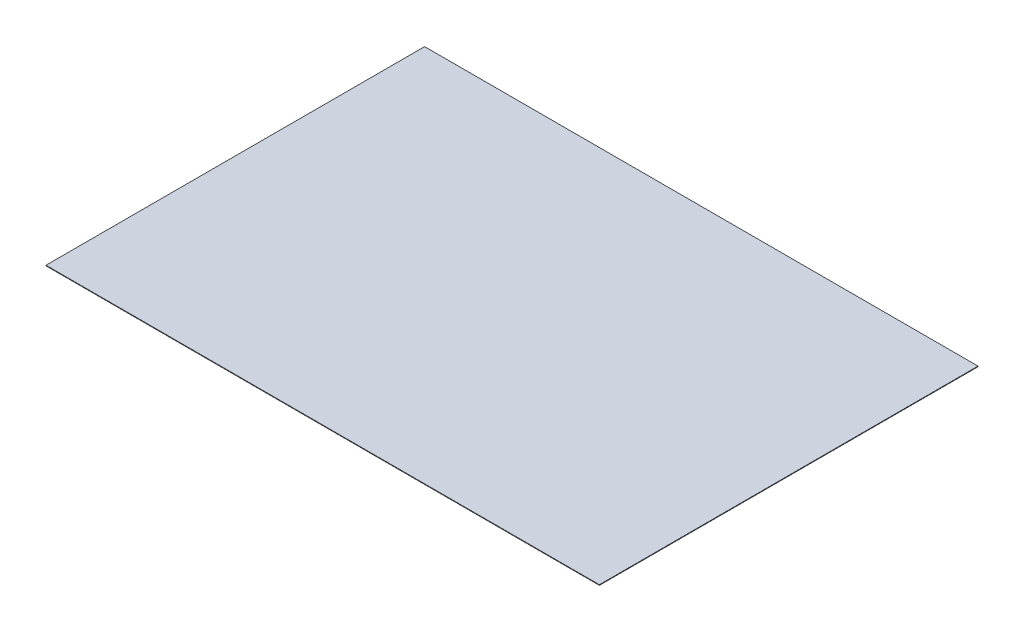
ISO-10303-21;
HEADER;
FILE_DESCRIPTION(('STEP AP214'),'2;1');
FILE_NAME('part.step','',(''),(''),'','','');
FILE_SCHEMA(('AUTOMOTIVE_DESIGN { 1 0 10303 214 1 1 1 1 }'));
ENDSEC;
DATA;
#1=APPLICATION_CONTEXT('core data for automotive mechanical design processes');
#2=APPLICATION_PROTOCOL_DEFINITION('international standard','automotive_design',2000,#1);
#3=PRODUCT_CONTEXT('',#1,'mechanical');
#4=PRODUCT('Part','Part','',(#3));
#5=PRODUCT_RELATED_PRODUCT_CATEGORY('part','',(#4));
#6=PRODUCT_DEFINITION_FORMATION('','',#4);
#7=PRODUCT_DEFINITION_CONTEXT('part definition',#1,'design');
#8=PRODUCT_DEFINITION('design','',#6,#7);
#9=PRODUCT_DEFINITION_SHAPE('','',#8);
#10=(LENGTH_UNIT() NAMED_UNIT(*) SI_UNIT(.MILLI.,.METRE.));
#11=(NAMED_UNIT(*) PLANE_ANGLE_UNIT() SI_UNIT($,.RADIAN.));
#12=(NAMED_UNIT(*) SI_UNIT($,.STERADIAN.) SOLID_ANGLE_UNIT());
#13=UNCERTAINTY_MEASURE_WITH_UNIT(LENGTH_MEASURE(1.E-05),#10,'distance_accuracy_value','');
#14=(GEOMETRIC_REPRESENTATION_CONTEXT(3) GLOBAL_UNCERTAINTY_ASSIGNED_CONTEXT((#13)) GLOBAL_UNIT_ASSIGNED_CONTEXT((#10,
#11,#12)) REPRESENTATION_CONTEXT('',''));
#15=CARTESIAN_POINT('',(0.,0.,0.));
#16=DIRECTION('',(0.,0.,1.));
#17=DIRECTION('',(1.,0.,0.));
#18=AXIS2_PLACEMENT_3D('',#15,#16,#17);
#19=CARTESIAN_POINT('',(0.,0.1,0.));
#20=DIRECTION('',(1.,0.,0.));
#21=DIRECTION('',(0.,0.,-1.));
#22=AXIS2_PLACEMENT_3D('',#19,#20,#21);
#23=PLANE('',#22);
#24=DIRECTION('',(0.,0.,1.));
#25=VECTOR('',#24,1.);
#26=CARTESIAN_POINT('',(0.,0.,0.));
#27=LINE('',#26,#25);
#28=CARTESIAN_POINT('',(0.,0.,-65.));
#29=VERTEX_POINT('',#28);
#30=CARTESIAN_POINT('',(0.,0.,0.));
#31=VERTEX_POINT('',#30);
#32=EDGE_CURVE('E96',#29,#31,#27,.T.);
#33=ORIENTED_EDGE('',*,*,#32,.T.);
#34=DIRECTION('',(0.,-1.,0.));
#35=VECTOR('',#34,1.);
#36=CARTESIAN_POINT('',(0.,0.1,0.));
#37=LINE('',#36,#35);
#38=CARTESIAN_POINT('',(0.,0.1,0.));
#39=VERTEX_POINT('',#38);
#40=EDGE_CURVE('E11',#39,#31,#37,.T.);
#41=ORIENTED_EDGE('',*,*,#40,.F.);
#42=DIRECTION('',(0.,0.,1.));
#43=VECTOR('',#42,1.);
#44=CARTESIAN_POINT('',(0.,0.1,0.));
#45=LINE('',#44,#43);
#46=CARTESIAN_POINT('',(0.,0.1,-65.));
#47=VERTEX_POINT('',#46);
#48=EDGE_CURVE('E84',#47,#39,#45,.T.);
#49=ORIENTED_EDGE('',*,*,#48,.F.);
#50=DIRECTION('',(0.,-1.,0.));
#51=VECTOR('',#50,1.);
#52=CARTESIAN_POINT('',(0.,0.1,-65.));
#53=LINE('',#52,#51);
#54=EDGE_CURVE('E92',#47,#29,#53,.T.);
#55=ORIENTED_EDGE('',*,*,#54,.T.);
#56=EDGE_LOOP('',(#33,#41,#49,#55));
#57=FACE_BOUND('',#56,.T.);
#58=ADVANCED_FACE('F33',(#57),#23,.F.);
#59=CARTESIAN_POINT('',(0.,0.1,0.));
#60=DIRECTION('',(0.,0.,-1.));
#61=DIRECTION('',(-1.,0.,0.));
#62=AXIS2_PLACEMENT_3D('',#59,#60,#61);
#63=PLANE('',#62);
#64=DIRECTION('',(1.,0.,0.));
#65=VECTOR('',#64,1.);
#66=CARTESIAN_POINT('',(0.,0.,0.));
#67=LINE('',#66,#65);
#68=CARTESIAN_POINT('',(95.,0.,0.));
#69=VERTEX_POINT('',#68);
#70=EDGE_CURVE('E88',#31,#69,#67,.T.);
#71=ORIENTED_EDGE('',*,*,#70,.T.);
#72=DIRECTION('',(0.,-1.,0.));
#73=VECTOR('',#72,1.);
#74=CARTESIAN_POINT('',(95.,0.1,0.));
#75=LINE('',#74,#73);
#76=CARTESIAN_POINT('',(95.,0.1,0.));
#77=VERTEX_POINT('',#76);
#78=EDGE_CURVE('E41',#77,#69,#75,.T.);
#79=ORIENTED_EDGE('',*,*,#78,.F.);
#80=DIRECTION('',(1.,0.,0.));
#81=VECTOR('',#80,1.);
#82=CARTESIAN_POINT('',(0.,0.1,0.));
#83=LINE('',#82,#81);
#84=EDGE_CURVE('E79',#39,#77,#83,.T.);
#85=ORIENTED_EDGE('',*,*,#84,.F.);
#86=ORIENTED_EDGE('',*,*,#40,.T.);
#87=EDGE_LOOP('',(#71,#79,#85,#86));
#88=FACE_BOUND('',#87,.T.);
#89=ADVANCED_FACE('F87',(#88),#63,.F.);
#90=CARTESIAN_POINT('',(95.,0.1,0.));
#91=DIRECTION('',(-1.,0.,0.));
#92=DIRECTION('',(0.,0.,1.));
#93=AXIS2_PLACEMENT_3D('',#90,#91,#92);
#94=PLANE('',#93);
#95=DIRECTION('',(0.,0.,-1.));
#96=VECTOR('',#95,1.);
#97=CARTESIAN_POINT('',(95.,0.,0.));
#98=LINE('',#97,#96);
#99=CARTESIAN_POINT('',(95.,0.,-65.));
#100=VERTEX_POINT('',#99);
#101=EDGE_CURVE('E66',#69,#100,#98,.T.);
#102=ORIENTED_EDGE('',*,*,#101,.T.);
#103=DIRECTION('',(0.,-1.,0.));
#104=VECTOR('',#103,1.);
#105=CARTESIAN_POINT('',(95.,0.1,-65.));
#106=LINE('',#105,#104);
#107=CARTESIAN_POINT('',(95.,0.1,-65.));
#108=VERTEX_POINT('',#107);
#109=EDGE_CURVE('E89',#108,#100,#106,.T.);
#110=ORIENTED_EDGE('',*,*,#109,.F.);
#111=DIRECTION('',(0.,0.,-1.));
#112=VECTOR('',#111,1.);
#113=CARTESIAN_POINT('',(95.,0.1,0.));
#114=LINE('',#113,#112);
#115=EDGE_CURVE('E82',#77,#108,#114,.T.);
#116=ORIENTED_EDGE('',*,*,#115,.F.);
#117=ORIENTED_EDGE('',*,*,#78,.T.);
#118=EDGE_LOOP('',(#102,#110,#116,#117));
#119=FACE_BOUND('',#118,.T.);
#120=ADVANCED_FACE('F90',(#119),#94,.F.);
#121=CARTESIAN_POINT('',(0.,0.1,-65.));
#122=DIRECTION('',(0.,0.,1.));
#123=DIRECTION('',(1.,0.,0.));
#124=AXIS2_PLACEMENT_3D('',#121,#122,#123);
#125=PLANE('',#124);
#126=DIRECTION('',(-1.,0.,0.));
#127=VECTOR('',#126,1.);
#128=CARTESIAN_POINT('',(0.,0.,-65.));
#129=LINE('',#128,#127);
#130=EDGE_CURVE('E72',#100,#29,#129,.T.);
#131=ORIENTED_EDGE('',*,*,#130,.T.);
#132=ORIENTED_EDGE('',*,*,#54,.F.);
#133=DIRECTION('',(-1.,0.,0.));
#134=VECTOR('',#133,1.);
#135=CARTESIAN_POINT('',(0.,0.1,-65.));
#136=LINE('',#135,#134);
#137=EDGE_CURVE('E49',#108,#47,#136,.T.);
#138=ORIENTED_EDGE('',*,*,#137,.F.);
#139=ORIENTED_EDGE('',*,*,#109,.T.);
#140=EDGE_LOOP('',(#131,#132,#138,#139));
#141=FACE_BOUND('',#140,.T.);
#142=ADVANCED_FACE('F103',(#141),#125,.F.);
#143=CARTESIAN_POINT('',(0.,0.1,0.));
#144=DIRECTION('',(0.,-1.,0.));
#145=DIRECTION('',(0.,0.,-1.));
#146=AXIS2_PLACEMENT_3D('',#143,#144,#145);
#147=PLANE('',#146);
#148=ORIENTED_EDGE('',*,*,#48,.T.);
#149=ORIENTED_EDGE('',*,*,#84,.T.);
#150=ORIENTED_EDGE('',*,*,#115,.T.);
#151=ORIENTED_EDGE('',*,*,#137,.T.);
#152=EDGE_LOOP('',(#148,#149,#150,#151));
#153=FACE_BOUND('',#152,.T.);
#154=ADVANCED_FACE('F80',(#153),#147,.F.);
#155=CARTESIAN_POINT('',(0.,0.,0.));
#156=DIRECTION('',(0.,-1.,0.));
#157=DIRECTION('',(0.,0.,-1.));
#158=AXIS2_PLACEMENT_3D('',#155,#156,#157);
#159=PLANE('',#158);
#160=ORIENTED_EDGE('',*,*,#32,.F.);
#161=ORIENTED_EDGE('',*,*,#130,.F.);
#162=ORIENTED_EDGE('',*,*,#101,.F.);
#163=ORIENTED_EDGE('',*,*,#70,.F.);
#164=EDGE_LOOP('',(#160,#161,#162,#163));
#165=FACE_BOUND('',#164,.T.);
#166=ADVANCED_FACE('F106',(#165),#159,.T.);
#167=CLOSED_SHELL('',(#58,#89,#120,#142,#154,#166));
#168=MANIFOLD_SOLID_BREP('B2',#167);
#169=ADVANCED_BREP_SHAPE_REPRESENTATION('',(#18,#168),#14);
#170=SHAPE_DEFINITION_REPRESENTATION(#9,#169);
ENDSEC;
END-ISO-10303-21;
